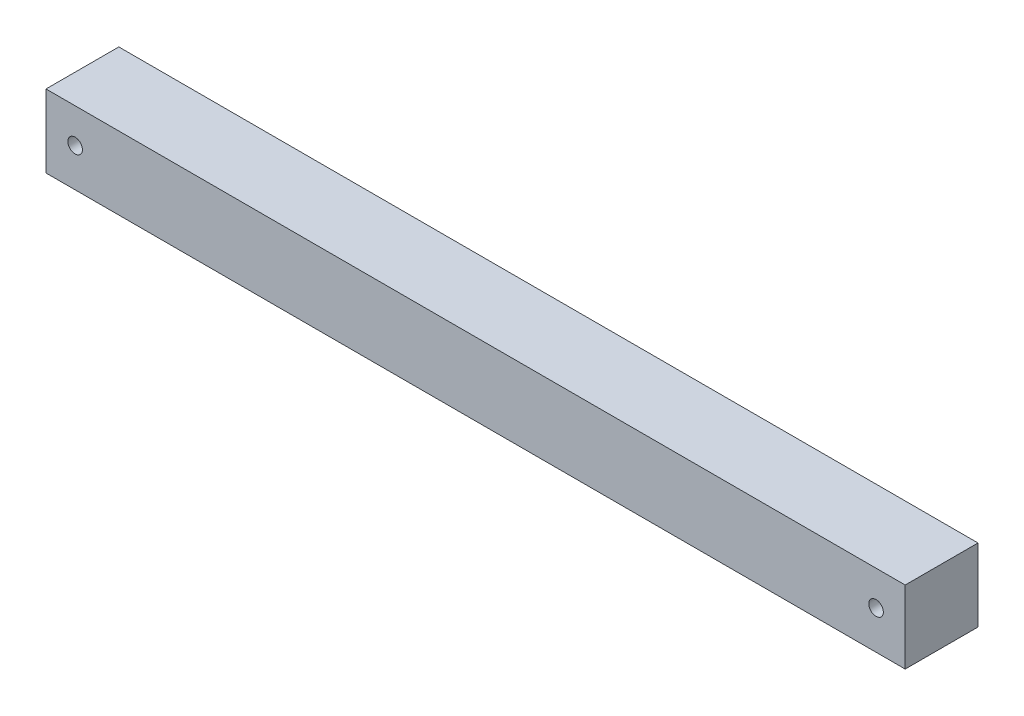
ISO-10303-21;
HEADER;
FILE_DESCRIPTION(('STEP AP214'),'2;1');
FILE_NAME('part.step','',(''),(''),'','','');
FILE_SCHEMA(('AUTOMOTIVE_DESIGN { 1 0 10303 214 1 1 1 1 }'));
ENDSEC;
DATA;
#1=APPLICATION_CONTEXT('core data for automotive mechanical design processes');
#2=APPLICATION_PROTOCOL_DEFINITION('international standard','automotive_design',2000,#1);
#3=PRODUCT_CONTEXT('',#1,'mechanical');
#4=PRODUCT('Part','Part','',(#3));
#5=PRODUCT_RELATED_PRODUCT_CATEGORY('part','',(#4));
#6=PRODUCT_DEFINITION_FORMATION('','',#4);
#7=PRODUCT_DEFINITION_CONTEXT('part definition',#1,'design');
#8=PRODUCT_DEFINITION('design','',#6,#7);
#9=PRODUCT_DEFINITION_SHAPE('','',#8);
#10=(LENGTH_UNIT() NAMED_UNIT(*) SI_UNIT(.MILLI.,.METRE.));
#11=(NAMED_UNIT(*) PLANE_ANGLE_UNIT() SI_UNIT($,.RADIAN.));
#12=(NAMED_UNIT(*) SI_UNIT($,.STERADIAN.) SOLID_ANGLE_UNIT());
#13=UNCERTAINTY_MEASURE_WITH_UNIT(LENGTH_MEASURE(1.E-05),#10,'distance_accuracy_value','');
#14=(GEOMETRIC_REPRESENTATION_CONTEXT(3) GLOBAL_UNCERTAINTY_ASSIGNED_CONTEXT((#13)) GLOBAL_UNIT_ASSIGNED_CONTEXT((#10,
#11,#12)) REPRESENTATION_CONTEXT('',''));
#15=CARTESIAN_POINT('',(0.,0.,0.));
#16=DIRECTION('',(0.,0.,1.));
#17=DIRECTION('',(1.,0.,0.));
#18=AXIS2_PLACEMENT_3D('',#15,#16,#17);
#19=CARTESIAN_POINT('',(-19.0580741392801,11.2859154929577,10.));
#20=DIRECTION('',(0.,0.,1.));
#21=DIRECTION('',(1.,0.,0.));
#22=AXIS2_PLACEMENT_3D('',#19,#20,#21);
#23=PLANE('',#22);
#24=CARTESIAN_POINT('',(94.9419258607199,16.5535520346232,10.));
#25=DIRECTION('',(0.,0.,1.));
#26=DIRECTION('',(1.,0.,0.));
#27=AXIS2_PLACEMENT_3D('',#24,#25,#26);
#28=CIRCLE('',#27,0.999999999999998);
#29=CARTESIAN_POINT('',(95.9419258607199,16.5535520346232,10.));
#30=VERTEX_POINT('',#29);
#31=EDGE_CURVE('E99',#30,#30,#28,.T.);
#32=ORIENTED_EDGE('',*,*,#31,.F.);
#33=EDGE_LOOP('',(#32));
#34=FACE_BOUND('',#33,.T.);
#35=DIRECTION('',(0.,-1.,0.));
#36=VECTOR('',#35,1.);
#37=CARTESIAN_POINT('',(-19.0580741392801,21.2859154929577,10.));
#38=LINE('',#37,#36);
#39=CARTESIAN_POINT('',(-19.0580741392801,21.2859154929577,10.));
#40=VERTEX_POINT('',#39);
#41=CARTESIAN_POINT('',(-19.0580741392801,11.2859154929577,10.));
#42=VERTEX_POINT('',#41);
#43=EDGE_CURVE('E84',#40,#42,#38,.T.);
#44=ORIENTED_EDGE('',*,*,#43,.T.);
#45=DIRECTION('',(1.,0.,0.));
#46=VECTOR('',#45,1.);
#47=CARTESIAN_POINT('',(-19.0580741392801,11.2859154929577,10.));
#48=LINE('',#47,#46);
#49=CARTESIAN_POINT('',(98.9419258607199,11.2859154929577,10.));
#50=VERTEX_POINT('',#49);
#51=EDGE_CURVE('E79',#42,#50,#48,.T.);
#52=ORIENTED_EDGE('',*,*,#51,.T.);
#53=DIRECTION('',(0.,1.,0.));
#54=VECTOR('',#53,1.);
#55=CARTESIAN_POINT('',(98.9419258607199,21.2859154929577,10.));
#56=LINE('',#55,#54);
#57=CARTESIAN_POINT('',(98.9419258607199,21.2859154929577,10.));
#58=VERTEX_POINT('',#57);
#59=EDGE_CURVE('E82',#50,#58,#56,.T.);
#60=ORIENTED_EDGE('',*,*,#59,.T.);
#61=DIRECTION('',(-1.,0.,0.));
#62=VECTOR('',#61,1.);
#63=CARTESIAN_POINT('',(-19.0580741392801,21.2859154929577,10.));
#64=LINE('',#63,#62);
#65=EDGE_CURVE('E49',#58,#40,#64,.T.);
#66=ORIENTED_EDGE('',*,*,#65,.T.);
#67=EDGE_LOOP('',(#44,#52,#60,#66));
#68=FACE_BOUND('',#67,.T.);
#69=CARTESIAN_POINT('',(-15.0580741392801,16.5535520346232,10.));
#70=DIRECTION('',(0.,0.,1.));
#71=DIRECTION('',(1.,0.,0.));
#72=AXIS2_PLACEMENT_3D('',#69,#70,#71);
#73=CIRCLE('',#72,1.);
#74=CARTESIAN_POINT('',(-14.0580741392801,16.5535520346232,10.));
#75=VERTEX_POINT('',#74);
#76=EDGE_CURVE('E114',#75,#75,#73,.T.);
#77=ORIENTED_EDGE('',*,*,#76,.F.);
#78=EDGE_LOOP('',(#77));
#79=FACE_BOUND('',#78,.T.);
#80=ADVANCED_FACE('F32',(#34,#68,#79),#23,.T.);
#81=CARTESIAN_POINT('',(-19.0580741392801,11.2859154929577,0.));
#82=DIRECTION('',(0.,0.,1.));
#83=DIRECTION('',(1.,0.,0.));
#84=AXIS2_PLACEMENT_3D('',#81,#82,#83);
#85=PLANE('',#84);
#86=CARTESIAN_POINT('',(94.9419258607199,16.5535520346232,0.));
#87=DIRECTION('',(0.,0.,1.));
#88=DIRECTION('',(1.,0.,0.));
#89=AXIS2_PLACEMENT_3D('',#86,#87,#88);
#90=CIRCLE('',#89,0.999999999999998);
#91=CARTESIAN_POINT('',(95.9419258607199,16.5535520346232,0.));
#92=VERTEX_POINT('',#91);
#93=EDGE_CURVE('E111',#92,#92,#90,.T.);
#94=ORIENTED_EDGE('',*,*,#93,.T.);
#95=EDGE_LOOP('',(#94));
#96=FACE_BOUND('',#95,.T.);
#97=DIRECTION('',(0.,-1.,0.));
#98=VECTOR('',#97,1.);
#99=CARTESIAN_POINT('',(-19.0580741392801,21.2859154929577,0.));
#100=LINE('',#99,#98);
#101=CARTESIAN_POINT('',(-19.0580741392801,21.2859154929577,0.));
#102=VERTEX_POINT('',#101);
#103=CARTESIAN_POINT('',(-19.0580741392801,11.2859154929577,0.));
#104=VERTEX_POINT('',#103);
#105=EDGE_CURVE('E96',#102,#104,#100,.T.);
#106=ORIENTED_EDGE('',*,*,#105,.F.);
#107=DIRECTION('',(-1.,0.,0.));
#108=VECTOR('',#107,1.);
#109=CARTESIAN_POINT('',(-19.0580741392801,21.2859154929577,0.));
#110=LINE('',#109,#108);
#111=CARTESIAN_POINT('',(98.9419258607199,21.2859154929577,0.));
#112=VERTEX_POINT('',#111);
#113=EDGE_CURVE('E72',#112,#102,#110,.T.);
#114=ORIENTED_EDGE('',*,*,#113,.F.);
#115=DIRECTION('',(0.,1.,0.));
#116=VECTOR('',#115,1.);
#117=CARTESIAN_POINT('',(98.9419258607199,21.2859154929577,0.));
#118=LINE('',#117,#116);
#119=CARTESIAN_POINT('',(98.9419258607199,11.2859154929577,0.));
#120=VERTEX_POINT('',#119);
#121=EDGE_CURVE('E66',#120,#112,#118,.T.);
#122=ORIENTED_EDGE('',*,*,#121,.F.);
#123=DIRECTION('',(1.,0.,0.));
#124=VECTOR('',#123,1.);
#125=CARTESIAN_POINT('',(-19.0580741392801,11.2859154929577,0.));
#126=LINE('',#125,#124);
#127=EDGE_CURVE('E88',#104,#120,#126,.T.);
#128=ORIENTED_EDGE('',*,*,#127,.F.);
#129=EDGE_LOOP('',(#106,#114,#122,#128));
#130=FACE_BOUND('',#129,.T.);
#131=CARTESIAN_POINT('',(-15.0580741392801,16.5535520346232,0.));
#132=DIRECTION('',(0.,0.,1.));
#133=DIRECTION('',(1.,0.,0.));
#134=AXIS2_PLACEMENT_3D('',#131,#132,#133);
#135=CIRCLE('',#134,1.);
#136=CARTESIAN_POINT('',(-14.0580741392801,16.5535520346232,0.));
#137=VERTEX_POINT('',#136);
#138=EDGE_CURVE('E117',#137,#137,#135,.T.);
#139=ORIENTED_EDGE('',*,*,#138,.T.);
#140=EDGE_LOOP('',(#139));
#141=FACE_BOUND('',#140,.T.);
#142=ADVANCED_FACE('F107',(#96,#130,#141),#85,.F.);
#143=CARTESIAN_POINT('',(-19.0580741392801,21.2859154929577,10.));
#144=DIRECTION('',(1.,0.,0.));
#145=DIRECTION('',(0.,0.,-1.));
#146=AXIS2_PLACEMENT_3D('',#143,#144,#145);
#147=PLANE('',#146);
#148=ORIENTED_EDGE('',*,*,#105,.T.);
#149=DIRECTION('',(0.,0.,-1.));
#150=VECTOR('',#149,1.);
#151=CARTESIAN_POINT('',(-19.0580741392801,11.2859154929577,10.));
#152=LINE('',#151,#150);
#153=EDGE_CURVE('E11',#42,#104,#152,.T.);
#154=ORIENTED_EDGE('',*,*,#153,.F.);
#155=ORIENTED_EDGE('',*,*,#43,.F.);
#156=DIRECTION('',(0.,0.,-1.));
#157=VECTOR('',#156,1.);
#158=CARTESIAN_POINT('',(-19.0580741392801,21.2859154929577,10.));
#159=LINE('',#158,#157);
#160=EDGE_CURVE('E92',#40,#102,#159,.T.);
#161=ORIENTED_EDGE('',*,*,#160,.T.);
#162=EDGE_LOOP('',(#148,#154,#155,#161));
#163=FACE_BOUND('',#162,.T.);
#164=ADVANCED_FACE('F34',(#163),#147,.F.);
#165=CARTESIAN_POINT('',(-19.0580741392801,11.2859154929577,10.));
#166=DIRECTION('',(0.,1.,0.));
#167=DIRECTION('',(0.,0.,1.));
#168=AXIS2_PLACEMENT_3D('',#165,#166,#167);
#169=PLANE('',#168);
#170=ORIENTED_EDGE('',*,*,#127,.T.);
#171=DIRECTION('',(0.,0.,-1.));
#172=VECTOR('',#171,1.);
#173=CARTESIAN_POINT('',(98.9419258607199,11.2859154929577,10.));
#174=LINE('',#173,#172);
#175=EDGE_CURVE('E41',#50,#120,#174,.T.);
#176=ORIENTED_EDGE('',*,*,#175,.F.);
#177=ORIENTED_EDGE('',*,*,#51,.F.);
#178=ORIENTED_EDGE('',*,*,#153,.T.);
#179=EDGE_LOOP('',(#170,#176,#177,#178));
#180=FACE_BOUND('',#179,.T.);
#181=ADVANCED_FACE('F87',(#180),#169,.F.);
#182=CARTESIAN_POINT('',(98.9419258607199,21.2859154929577,10.));
#183=DIRECTION('',(-1.,0.,0.));
#184=DIRECTION('',(0.,-1.,0.));
#185=AXIS2_PLACEMENT_3D('',#182,#183,#184);
#186=PLANE('',#185);
#187=ORIENTED_EDGE('',*,*,#121,.T.);
#188=DIRECTION('',(0.,0.,-1.));
#189=VECTOR('',#188,1.);
#190=CARTESIAN_POINT('',(98.9419258607199,21.2859154929577,10.));
#191=LINE('',#190,#189);
#192=EDGE_CURVE('E89',#58,#112,#191,.T.);
#193=ORIENTED_EDGE('',*,*,#192,.F.);
#194=ORIENTED_EDGE('',*,*,#59,.F.);
#195=ORIENTED_EDGE('',*,*,#175,.T.);
#196=EDGE_LOOP('',(#187,#193,#194,#195));
#197=FACE_BOUND('',#196,.T.);
#198=ADVANCED_FACE('F90',(#197),#186,.F.);
#199=CARTESIAN_POINT('',(-19.0580741392801,21.2859154929577,10.));
#200=DIRECTION('',(0.,-1.,0.));
#201=DIRECTION('',(0.,0.,-1.));
#202=AXIS2_PLACEMENT_3D('',#199,#200,#201);
#203=PLANE('',#202);
#204=ORIENTED_EDGE('',*,*,#113,.T.);
#205=ORIENTED_EDGE('',*,*,#160,.F.);
#206=ORIENTED_EDGE('',*,*,#65,.F.);
#207=ORIENTED_EDGE('',*,*,#192,.T.);
#208=EDGE_LOOP('',(#204,#205,#206,#207));
#209=FACE_BOUND('',#208,.T.);
#210=ADVANCED_FACE('F104',(#209),#203,.F.);
#211=CARTESIAN_POINT('',(94.9419258607199,16.5535520346232,10.));
#212=DIRECTION('',(0.,0.,-1.));
#213=DIRECTION('',(-1.,0.,0.));
#214=AXIS2_PLACEMENT_3D('',#211,#212,#213);
#215=CYLINDRICAL_SURFACE('',#214,0.999999999999998);
#216=ORIENTED_EDGE('',*,*,#31,.T.);
#217=EDGE_LOOP('',(#216));
#218=FACE_BOUND('',#217,.T.);
#219=ORIENTED_EDGE('',*,*,#93,.F.);
#220=EDGE_LOOP('',(#219));
#221=FACE_BOUND('',#220,.T.);
#222=ADVANCED_FACE('F135',(#218,#221),#215,.F.);
#223=CARTESIAN_POINT('',(-15.0580741392801,16.5535520346232,10.));
#224=DIRECTION('',(0.,0.,-1.));
#225=DIRECTION('',(-1.,0.,0.));
#226=AXIS2_PLACEMENT_3D('',#223,#224,#225);
#227=CYLINDRICAL_SURFACE('',#226,1.);
#228=ORIENTED_EDGE('',*,*,#76,.T.);
#229=EDGE_LOOP('',(#228));
#230=FACE_BOUND('',#229,.T.);
#231=ORIENTED_EDGE('',*,*,#138,.F.);
#232=EDGE_LOOP('',(#231));
#233=FACE_BOUND('',#232,.T.);
#234=ADVANCED_FACE('F123',(#230,#233),#227,.F.);
#235=CLOSED_SHELL('',(#80,#142,#164,#181,#198,#210,#222,#234));
#236=MANIFOLD_SOLID_BREP('B2',#235);
#237=ADVANCED_BREP_SHAPE_REPRESENTATION('',(#18,#236),#14);
#238=SHAPE_DEFINITION_REPRESENTATION(#9,#237);
ENDSEC;
END-ISO-10303-21;
